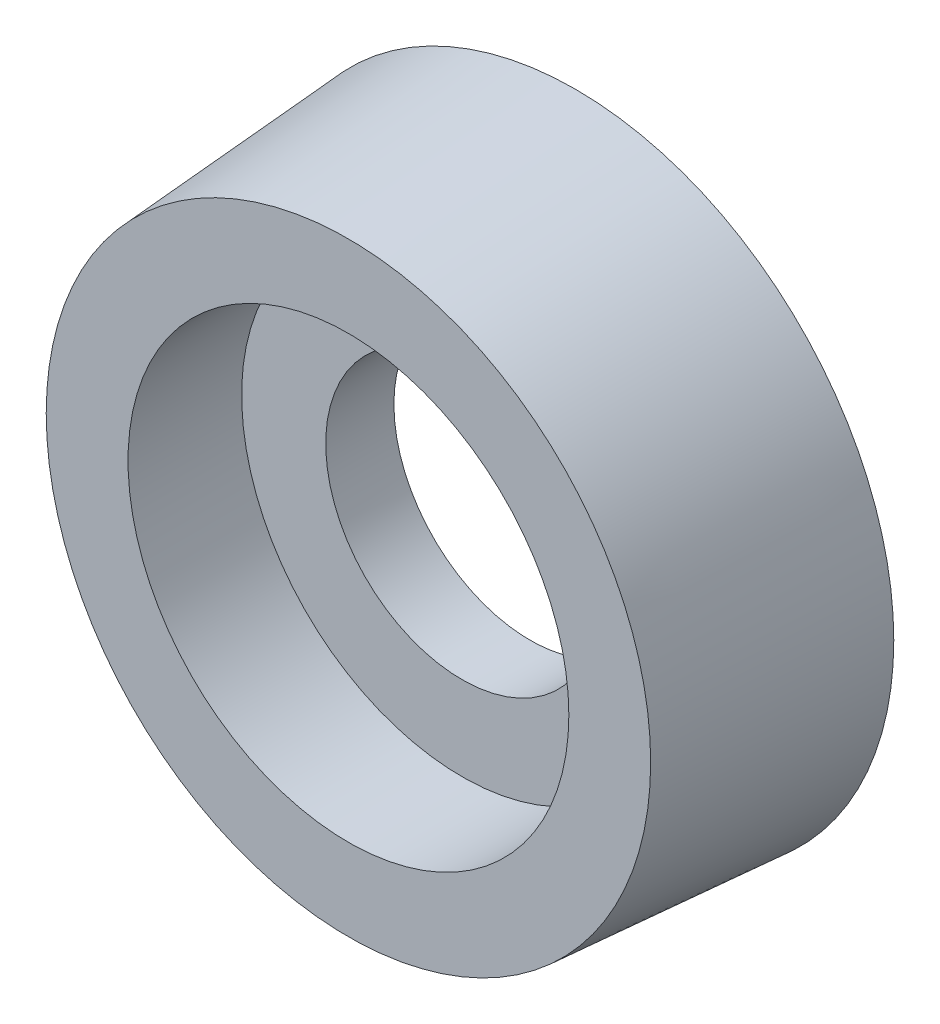
ISO-10303-21;
HEADER;
FILE_DESCRIPTION(('STEP AP214'),'2;1');
FILE_NAME('part.step','',(''),(''),'','','');
FILE_SCHEMA(('AUTOMOTIVE_DESIGN { 1 0 10303 214 1 1 1 1 }'));
ENDSEC;
DATA;
#1=APPLICATION_CONTEXT('core data for automotive mechanical design processes');
#2=APPLICATION_PROTOCOL_DEFINITION('international standard','automotive_design',2000,#1);
#3=PRODUCT_CONTEXT('',#1,'mechanical');
#4=PRODUCT('Part','Part','',(#3));
#5=PRODUCT_RELATED_PRODUCT_CATEGORY('part','',(#4));
#6=PRODUCT_DEFINITION_FORMATION('','',#4);
#7=PRODUCT_DEFINITION_CONTEXT('part definition',#1,'design');
#8=PRODUCT_DEFINITION('design','',#6,#7);
#9=PRODUCT_DEFINITION_SHAPE('','',#8);
#10=(LENGTH_UNIT() NAMED_UNIT(*) SI_UNIT(.MILLI.,.METRE.));
#11=(NAMED_UNIT(*) PLANE_ANGLE_UNIT() SI_UNIT($,.RADIAN.));
#12=(NAMED_UNIT(*) SI_UNIT($,.STERADIAN.) SOLID_ANGLE_UNIT());
#13=UNCERTAINTY_MEASURE_WITH_UNIT(LENGTH_MEASURE(1.E-05),#10,'distance_accuracy_value','');
#14=(GEOMETRIC_REPRESENTATION_CONTEXT(3) GLOBAL_UNCERTAINTY_ASSIGNED_CONTEXT((#13)) GLOBAL_UNIT_ASSIGNED_CONTEXT((#10,
#11,#12)) REPRESENTATION_CONTEXT('',''));
#15=CARTESIAN_POINT('',(0.,0.,0.));
#16=DIRECTION('',(0.,0.,1.));
#17=DIRECTION('',(1.,0.,0.));
#18=AXIS2_PLACEMENT_3D('',#15,#16,#17);
#19=CARTESIAN_POINT('',(0.,0.,0.));
#20=DIRECTION('',(0.,0.,-1.));
#21=DIRECTION('',(1.,0.,0.));
#22=AXIS2_PLACEMENT_3D('',#19,#20,#21);
#23=CONICAL_SURFACE('',#22,7.,0.0698131700797732);
#24=CARTESIAN_POINT('',(0.,0.,5.));
#25=DIRECTION('',(0.,0.,1.));
#26=DIRECTION('',(1.,0.,0.));
#27=AXIS2_PLACEMENT_3D('',#24,#25,#26);
#28=CIRCLE('',#27,6.65036594028245);
#29=CARTESIAN_POINT('',(6.65036594028245,0.,5.));
#30=VERTEX_POINT('',#29);
#31=EDGE_CURVE('E10',#30,#30,#28,.T.);
#32=ORIENTED_EDGE('',*,*,#31,.F.);
#33=EDGE_LOOP('',(#32));
#34=FACE_BOUND('',#33,.T.);
#35=CARTESIAN_POINT('',(0.,0.,0.));
#36=DIRECTION('',(0.,0.,1.));
#37=DIRECTION('',(1.,0.,0.));
#38=AXIS2_PLACEMENT_3D('',#35,#36,#37);
#39=CIRCLE('',#38,7.);
#40=CARTESIAN_POINT('',(7.,0.,0.));
#41=VERTEX_POINT('',#40);
#42=EDGE_CURVE('E45',#41,#41,#39,.T.);
#43=ORIENTED_EDGE('',*,*,#42,.T.);
#44=EDGE_LOOP('',(#43));
#45=FACE_BOUND('',#44,.T.);
#46=ADVANCED_FACE('F37',(#34,#45),#23,.T.);
#47=CARTESIAN_POINT('',(0.,0.,5.));
#48=DIRECTION('',(0.,0.,1.));
#49=DIRECTION('',(1.,0.,0.));
#50=AXIS2_PLACEMENT_3D('',#47,#48,#49);
#51=PLANE('',#50);
#52=CARTESIAN_POINT('',(0.,0.,5.));
#53=DIRECTION('',(0.,0.,1.));
#54=DIRECTION('',(1.,0.,0.));
#55=AXIS2_PLACEMENT_3D('',#52,#53,#54);
#56=CIRCLE('',#55,4.85);
#57=CARTESIAN_POINT('',(4.85,0.,5.));
#58=VERTEX_POINT('',#57);
#59=EDGE_CURVE('E61',#58,#58,#56,.T.);
#60=ORIENTED_EDGE('',*,*,#59,.F.);
#61=EDGE_LOOP('',(#60));
#62=FACE_BOUND('',#61,.T.);
#63=ORIENTED_EDGE('',*,*,#31,.T.);
#64=EDGE_LOOP('',(#63));
#65=FACE_BOUND('',#64,.T.);
#66=ADVANCED_FACE('F92',(#62,#65),#51,.T.);
#67=CARTESIAN_POINT('',(0.,0.,0.));
#68=DIRECTION('',(0.,0.,1.));
#69=DIRECTION('',(1.,0.,0.));
#70=AXIS2_PLACEMENT_3D('',#67,#68,#69);
#71=PLANE('',#70);
#72=CARTESIAN_POINT('',(0.,0.,0.));
#73=DIRECTION('',(0.,0.,-1.));
#74=DIRECTION('',(-1.,0.,0.));
#75=AXIS2_PLACEMENT_3D('',#72,#73,#74);
#76=CIRCLE('',#75,5.);
#77=CARTESIAN_POINT('',(-5.,0.,0.));
#78=VERTEX_POINT('',#77);
#79=EDGE_CURVE('E53',#78,#78,#76,.T.);
#80=ORIENTED_EDGE('',*,*,#79,.F.);
#81=EDGE_LOOP('',(#80));
#82=FACE_BOUND('',#81,.T.);
#83=ORIENTED_EDGE('',*,*,#42,.F.);
#84=EDGE_LOOP('',(#83));
#85=FACE_BOUND('',#84,.T.);
#86=ADVANCED_FACE('F94',(#82,#85),#71,.F.);
#87=CARTESIAN_POINT('',(0.,0.,1.));
#88=DIRECTION('',(0.,0.,-1.));
#89=DIRECTION('',(-1.,0.,0.));
#90=AXIS2_PLACEMENT_3D('',#87,#88,#89);
#91=CYLINDRICAL_SURFACE('',#90,5.);
#92=CARTESIAN_POINT('',(0.,0.,1.));
#93=DIRECTION('',(0.,0.,-1.));
#94=DIRECTION('',(-1.,0.,0.));
#95=AXIS2_PLACEMENT_3D('',#92,#93,#94);
#96=CIRCLE('',#95,5.);
#97=CARTESIAN_POINT('',(-5.,0.,1.));
#98=VERTEX_POINT('',#97);
#99=EDGE_CURVE('E50',#98,#98,#96,.T.);
#100=ORIENTED_EDGE('',*,*,#99,.F.);
#101=EDGE_LOOP('',(#100));
#102=FACE_BOUND('',#101,.T.);
#103=ORIENTED_EDGE('',*,*,#79,.T.);
#104=EDGE_LOOP('',(#103));
#105=FACE_BOUND('',#104,.T.);
#106=ADVANCED_FACE('F100',(#102,#105),#91,.F.);
#107=CARTESIAN_POINT('',(0.,0.,1.));
#108=DIRECTION('',(0.,0.,-1.));
#109=DIRECTION('',(-1.,0.,0.));
#110=AXIS2_PLACEMENT_3D('',#107,#108,#109);
#111=PLANE('',#110);
#112=CARTESIAN_POINT('',(0.,0.,1.));
#113=DIRECTION('',(0.,0.,-1.));
#114=DIRECTION('',(-1.,0.,0.));
#115=AXIS2_PLACEMENT_3D('',#112,#113,#114);
#116=CIRCLE('',#115,3.);
#117=CARTESIAN_POINT('',(-3.,0.,1.));
#118=VERTEX_POINT('',#117);
#119=EDGE_CURVE('E65',#118,#118,#116,.T.);
#120=ORIENTED_EDGE('',*,*,#119,.F.);
#121=EDGE_LOOP('',(#120));
#122=FACE_BOUND('',#121,.T.);
#123=ORIENTED_EDGE('',*,*,#99,.T.);
#124=EDGE_LOOP('',(#123));
#125=FACE_BOUND('',#124,.T.);
#126=ADVANCED_FACE('F88',(#122,#125),#111,.T.);
#127=CARTESIAN_POINT('',(0.,0.,2.5));
#128=DIRECTION('',(0.,0.,1.));
#129=DIRECTION('',(1.,0.,0.));
#130=AXIS2_PLACEMENT_3D('',#127,#128,#129);
#131=CYLINDRICAL_SURFACE('',#130,4.85);
#132=CARTESIAN_POINT('',(0.,0.,2.5));
#133=DIRECTION('',(0.,0.,1.));
#134=DIRECTION('',(1.,0.,0.));
#135=AXIS2_PLACEMENT_3D('',#132,#133,#134);
#136=CIRCLE('',#135,4.85);
#137=CARTESIAN_POINT('',(4.85,0.,2.5));
#138=VERTEX_POINT('',#137);
#139=EDGE_CURVE('E57',#138,#138,#136,.T.);
#140=ORIENTED_EDGE('',*,*,#139,.F.);
#141=EDGE_LOOP('',(#140));
#142=FACE_BOUND('',#141,.T.);
#143=ORIENTED_EDGE('',*,*,#59,.T.);
#144=EDGE_LOOP('',(#143));
#145=FACE_BOUND('',#144,.T.);
#146=ADVANCED_FACE('F82',(#142,#145),#131,.F.);
#147=CARTESIAN_POINT('',(0.,0.,2.5));
#148=DIRECTION('',(0.,0.,1.));
#149=DIRECTION('',(1.,0.,0.));
#150=AXIS2_PLACEMENT_3D('',#147,#148,#149);
#151=PLANE('',#150);
#152=CARTESIAN_POINT('',(0.,0.,2.5));
#153=DIRECTION('',(0.,0.,1.));
#154=DIRECTION('',(1.,0.,0.));
#155=AXIS2_PLACEMENT_3D('',#152,#153,#154);
#156=CIRCLE('',#155,3.);
#157=CARTESIAN_POINT('',(3.,0.,2.5));
#158=VERTEX_POINT('',#157);
#159=EDGE_CURVE('E40',#158,#158,#156,.T.);
#160=ORIENTED_EDGE('',*,*,#159,.F.);
#161=EDGE_LOOP('',(#160));
#162=FACE_BOUND('',#161,.T.);
#163=ORIENTED_EDGE('',*,*,#139,.T.);
#164=EDGE_LOOP('',(#163));
#165=FACE_BOUND('',#164,.T.);
#166=ADVANCED_FACE('F79',(#162,#165),#151,.T.);
#167=CARTESIAN_POINT('',(0.,0.,0.));
#168=DIRECTION('',(0.,0.,1.));
#169=DIRECTION('',(1.,0.,0.));
#170=AXIS2_PLACEMENT_3D('',#167,#168,#169);
#171=CYLINDRICAL_SURFACE('',#170,3.);
#172=ORIENTED_EDGE('',*,*,#119,.T.);
#173=EDGE_LOOP('',(#172));
#174=FACE_BOUND('',#173,.T.);
#175=ORIENTED_EDGE('',*,*,#159,.T.);
#176=EDGE_LOOP('',(#175));
#177=FACE_BOUND('',#176,.T.);
#178=ADVANCED_FACE('F77',(#174,#177),#171,.F.);
#179=CLOSED_SHELL('',(#46,#66,#86,#106,#126,#146,#166,#178));
#180=MANIFOLD_SOLID_BREP('B2',#179);
#181=ADVANCED_BREP_SHAPE_REPRESENTATION('',(#18,#180),#14);
#182=SHAPE_DEFINITION_REPRESENTATION(#9,#181);
ENDSEC;
END-ISO-10303-21;
